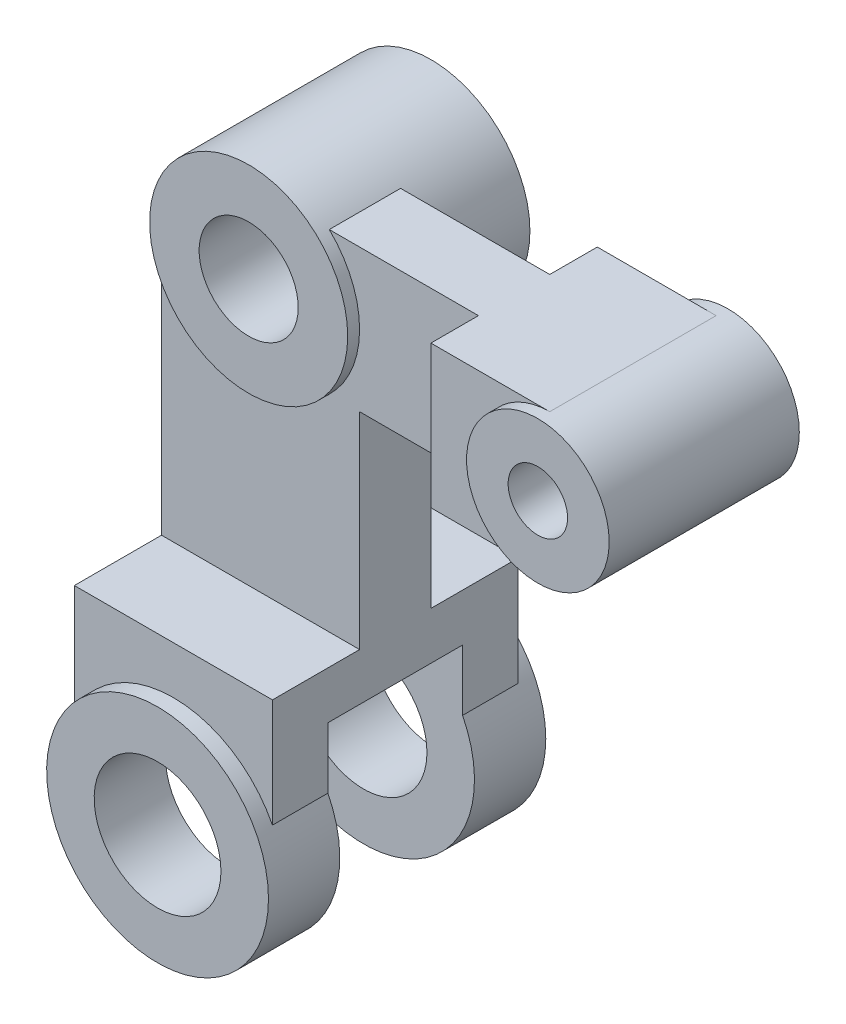
ISO-10303-21;
HEADER;
FILE_DESCRIPTION(('STEP AP214'),'2;1');
FILE_NAME('part.step','',(''),(''),'','','');
FILE_SCHEMA(('AUTOMOTIVE_DESIGN { 1 0 10303 214 1 1 1 1 }'));
ENDSEC;
DATA;
#1=APPLICATION_CONTEXT('core data for automotive mechanical design processes');
#2=APPLICATION_PROTOCOL_DEFINITION('international standard','automotive_design',2000,#1);
#3=PRODUCT_CONTEXT('',#1,'mechanical');
#4=PRODUCT('Part','Part','',(#3));
#5=PRODUCT_RELATED_PRODUCT_CATEGORY('part','',(#4));
#6=PRODUCT_DEFINITION_FORMATION('','',#4);
#7=PRODUCT_DEFINITION_CONTEXT('part definition',#1,'design');
#8=PRODUCT_DEFINITION('design','',#6,#7);
#9=PRODUCT_DEFINITION_SHAPE('','',#8);
#10=(LENGTH_UNIT() NAMED_UNIT(*) SI_UNIT(.MILLI.,.METRE.));
#11=(NAMED_UNIT(*) PLANE_ANGLE_UNIT() SI_UNIT($,.RADIAN.));
#12=(NAMED_UNIT(*) SI_UNIT($,.STERADIAN.) SOLID_ANGLE_UNIT());
#13=UNCERTAINTY_MEASURE_WITH_UNIT(LENGTH_MEASURE(1.E-05),#10,'distance_accuracy_value','');
#14=(GEOMETRIC_REPRESENTATION_CONTEXT(3) GLOBAL_UNCERTAINTY_ASSIGNED_CONTEXT((#13)) GLOBAL_UNIT_ASSIGNED_CONTEXT((#10,
#11,#12)) REPRESENTATION_CONTEXT('',''));
#15=CARTESIAN_POINT('',(0.,0.,0.));
#16=DIRECTION('',(0.,0.,1.));
#17=DIRECTION('',(1.,0.,0.));
#18=AXIS2_PLACEMENT_3D('',#15,#16,#17);
#19=CARTESIAN_POINT('',(0.,0.,26.));
#20=DIRECTION('',(0.,0.,-1.));
#21=DIRECTION('',(-1.,0.,0.));
#22=AXIS2_PLACEMENT_3D('',#19,#20,#21);
#23=CYLINDRICAL_SURFACE('',#22,16.);
#24=CARTESIAN_POINT('',(0.,0.,-26.));
#25=DIRECTION('',(0.,0.,-1.));
#26=DIRECTION('',(0.,1.,0.));
#27=AXIS2_PLACEMENT_3D('',#24,#25,#26);
#28=CIRCLE('',#27,16.);
#29=CARTESIAN_POINT('',(0.,16.,-26.));
#30=VERTEX_POINT('',#29);
#31=EDGE_CURVE('E276',#30,#30,#28,.T.);
#32=ORIENTED_EDGE('',*,*,#31,.F.);
#33=EDGE_LOOP('',(#32));
#34=FACE_BOUND('',#33,.T.);
#35=CARTESIAN_POINT('',(0.,0.,-44.));
#36=DIRECTION('',(0.,0.,1.));
#37=DIRECTION('',(1.,0.,0.));
#38=AXIS2_PLACEMENT_3D('',#35,#36,#37);
#39=CIRCLE('',#38,16.);
#40=CARTESIAN_POINT('',(16.,0.,-44.));
#41=VERTEX_POINT('',#40);
#42=EDGE_CURVE('E283',#41,#41,#39,.T.);
#43=ORIENTED_EDGE('',*,*,#42,.F.);
#44=EDGE_LOOP('',(#43));
#45=FACE_BOUND('',#44,.T.);
#46=ADVANCED_FACE('F41',(#34,#45),#23,.F.);
#47=CARTESIAN_POINT('',(0.,0.,26.));
#48=DIRECTION('',(0.,0.,-1.));
#49=DIRECTION('',(-1.,0.,0.));
#50=AXIS2_PLACEMENT_3D('',#47,#48,#49);
#51=CYLINDRICAL_SURFACE('',#50,28.);
#52=CARTESIAN_POINT('',(0.,0.,26.));
#53=DIRECTION('',(0.,0.,1.));
#54=DIRECTION('',(1.,0.,0.));
#55=AXIS2_PLACEMENT_3D('',#52,#53,#54);
#56=CIRCLE('',#55,28.);
#57=CARTESIAN_POINT('',(28.,0.,26.));
#58=VERTEX_POINT('',#57);
#59=EDGE_CURVE('E288',#58,#58,#56,.T.);
#60=ORIENTED_EDGE('',*,*,#59,.F.);
#61=EDGE_LOOP('',(#60));
#62=FACE_BOUND('',#61,.T.);
#63=DIRECTION('',(0.,0.,-1.));
#64=VECTOR('',#63,1.);
#65=CARTESIAN_POINT('',(-25.,12.6095202129185,22.));
#66=LINE('',#65,#64);
#67=CARTESIAN_POINT('',(-25.,12.6095202129185,22.));
#68=VERTEX_POINT('',#67);
#69=CARTESIAN_POINT('',(-25.,12.6095202129185,8.));
#70=VERTEX_POINT('',#69);
#71=EDGE_CURVE('E330',#68,#70,#66,.T.);
#72=ORIENTED_EDGE('',*,*,#71,.T.);
#73=CARTESIAN_POINT('',(0.,0.,8.));
#74=DIRECTION('',(0.,0.,1.));
#75=DIRECTION('',(0.,-1.,0.));
#76=AXIS2_PLACEMENT_3D('',#73,#74,#75);
#77=CIRCLE('',#76,28.);
#78=CARTESIAN_POINT('',(25.,12.6095202129185,8.));
#79=VERTEX_POINT('',#78);
#80=EDGE_CURVE('E393',#70,#79,#77,.T.);
#81=ORIENTED_EDGE('',*,*,#80,.T.);
#82=DIRECTION('',(0.,0.,-1.));
#83=VECTOR('',#82,1.);
#84=CARTESIAN_POINT('',(25.,12.6095202129185,22.));
#85=LINE('',#84,#83);
#86=CARTESIAN_POINT('',(25.,12.6095202129185,22.));
#87=VERTEX_POINT('',#86);
#88=EDGE_CURVE('E345',#87,#79,#85,.T.);
#89=ORIENTED_EDGE('',*,*,#88,.F.);
#90=CARTESIAN_POINT('',(0.,0.,22.));
#91=DIRECTION('',(0.,0.,1.));
#92=DIRECTION('',(1.,0.,0.));
#93=AXIS2_PLACEMENT_3D('',#90,#91,#92);
#94=CIRCLE('',#93,28.);
#95=EDGE_CURVE('E300',#87,#68,#94,.T.);
#96=ORIENTED_EDGE('',*,*,#95,.T.);
#97=EDGE_LOOP('',(#72,#81,#89,#96));
#98=FACE_BOUND('',#97,.T.);
#99=ADVANCED_FACE('F481',(#62,#98),#51,.T.);
#100=CARTESIAN_POINT('',(0.,110.,-43.));
#101=DIRECTION('',(0.,0.,1.));
#102=DIRECTION('',(1.,0.,0.));
#103=AXIS2_PLACEMENT_3D('',#100,#101,#102);
#104=CYLINDRICAL_SURFACE('',#103,25.);
#105=CARTESIAN_POINT('',(0.,110.,0.));
#106=DIRECTION('',(0.,0.,1.));
#107=DIRECTION('',(1.,0.,0.));
#108=AXIS2_PLACEMENT_3D('',#105,#106,#107);
#109=CIRCLE('',#108,25.);
#110=CARTESIAN_POINT('',(-25.,110.,0.));
#111=VERTEX_POINT('',#110);
#112=CARTESIAN_POINT('',(17.3493515728975,128.,0.));
#113=VERTEX_POINT('',#112);
#114=EDGE_CURVE('E57',#111,#113,#109,.T.);
#115=ORIENTED_EDGE('',*,*,#114,.T.);
#116=DIRECTION('',(0.,0.,-1.));
#117=VECTOR('',#116,1.);
#118=CARTESIAN_POINT('',(17.3493515728975,128.,0.));
#119=LINE('',#118,#117);
#120=CARTESIAN_POINT('',(17.3493515728975,128.,-18.));
#121=VERTEX_POINT('',#120);
#122=EDGE_CURVE('E234',#113,#121,#119,.T.);
#123=ORIENTED_EDGE('',*,*,#122,.T.);
#124=CARTESIAN_POINT('',(0.,110.,-18.));
#125=DIRECTION('',(0.,0.,1.));
#126=DIRECTION('',(1.,0.,0.));
#127=AXIS2_PLACEMENT_3D('',#124,#125,#126);
#128=CIRCLE('',#127,25.);
#129=CARTESIAN_POINT('',(-25.,110.,-18.));
#130=VERTEX_POINT('',#129);
#131=EDGE_CURVE('E65',#130,#121,#128,.T.);
#132=ORIENTED_EDGE('',*,*,#131,.F.);
#133=DIRECTION('',(0.,0.,1.));
#134=VECTOR('',#133,1.);
#135=CARTESIAN_POINT('',(-25.,110.,-18.));
#136=LINE('',#135,#134);
#137=EDGE_CURVE('E363',#130,#111,#136,.T.);
#138=ORIENTED_EDGE('',*,*,#137,.T.);
#139=EDGE_LOOP('',(#115,#123,#132,#138));
#140=FACE_BOUND('',#139,.T.);
#141=CARTESIAN_POINT('',(0.,110.,-43.));
#142=DIRECTION('',(0.,0.,1.));
#143=DIRECTION('',(1.,0.,0.));
#144=AXIS2_PLACEMENT_3D('',#141,#142,#143);
#145=CIRCLE('',#144,25.);
#146=CARTESIAN_POINT('',(25.,110.,-43.));
#147=VERTEX_POINT('',#146);
#148=EDGE_CURVE('E389',#147,#147,#145,.T.);
#149=ORIENTED_EDGE('',*,*,#148,.T.);
#150=EDGE_LOOP('',(#149));
#151=FACE_BOUND('',#150,.T.);
#152=CARTESIAN_POINT('',(0.,110.,3.));
#153=DIRECTION('',(0.,0.,1.));
#154=DIRECTION('',(1.,0.,0.));
#155=AXIS2_PLACEMENT_3D('',#152,#153,#154);
#156=CIRCLE('',#155,25.);
#157=CARTESIAN_POINT('',(25.,110.,3.));
#158=VERTEX_POINT('',#157);
#159=EDGE_CURVE('E381',#158,#158,#156,.T.);
#160=ORIENTED_EDGE('',*,*,#159,.F.);
#161=EDGE_LOOP('',(#160));
#162=FACE_BOUND('',#161,.T.);
#163=ADVANCED_FACE('F489',(#140,#151,#162),#104,.T.);
#164=CARTESIAN_POINT('',(0.,110.,-43.));
#165=DIRECTION('',(0.,0.,1.));
#166=DIRECTION('',(1.,0.,0.));
#167=AXIS2_PLACEMENT_3D('',#164,#165,#166);
#168=CYLINDRICAL_SURFACE('',#167,12.5);
#169=CARTESIAN_POINT('',(0.,110.,-43.));
#170=DIRECTION('',(0.,0.,1.));
#171=DIRECTION('',(1.,0.,0.));
#172=AXIS2_PLACEMENT_3D('',#169,#170,#171);
#173=CIRCLE('',#172,12.5);
#174=CARTESIAN_POINT('',(12.5,110.,-43.));
#175=VERTEX_POINT('',#174);
#176=EDGE_CURVE('E385',#175,#175,#173,.T.);
#177=ORIENTED_EDGE('',*,*,#176,.F.);
#178=EDGE_LOOP('',(#177));
#179=FACE_BOUND('',#178,.T.);
#180=CARTESIAN_POINT('',(0.,110.,3.));
#181=DIRECTION('',(0.,0.,1.));
#182=DIRECTION('',(1.,0.,0.));
#183=AXIS2_PLACEMENT_3D('',#180,#181,#182);
#184=CIRCLE('',#183,12.5);
#185=CARTESIAN_POINT('',(12.5,110.,3.));
#186=VERTEX_POINT('',#185);
#187=EDGE_CURVE('E377',#186,#186,#184,.T.);
#188=ORIENTED_EDGE('',*,*,#187,.T.);
#189=EDGE_LOOP('',(#188));
#190=FACE_BOUND('',#189,.T.);
#191=ADVANCED_FACE('F43',(#179,#190),#168,.F.);
#192=CARTESIAN_POINT('',(0.,0.,-43.));
#193=DIRECTION('',(0.,0.,1.));
#194=DIRECTION('',(1.,0.,0.));
#195=AXIS2_PLACEMENT_3D('',#192,#193,#194);
#196=PLANE('',#195);
#197=ORIENTED_EDGE('',*,*,#176,.T.);
#198=EDGE_LOOP('',(#197));
#199=FACE_BOUND('',#198,.T.);
#200=ORIENTED_EDGE('',*,*,#148,.F.);
#201=EDGE_LOOP('',(#200));
#202=FACE_BOUND('',#201,.T.);
#203=ADVANCED_FACE('F542',(#199,#202),#196,.F.);
#204=CARTESIAN_POINT('',(0.,0.,3.));
#205=DIRECTION('',(0.,0.,1.));
#206=DIRECTION('',(1.,0.,0.));
#207=AXIS2_PLACEMENT_3D('',#204,#205,#206);
#208=PLANE('',#207);
#209=ORIENTED_EDGE('',*,*,#187,.F.);
#210=EDGE_LOOP('',(#209));
#211=FACE_BOUND('',#210,.T.);
#212=ORIENTED_EDGE('',*,*,#159,.T.);
#213=EDGE_LOOP('',(#212));
#214=FACE_BOUND('',#213,.T.);
#215=ADVANCED_FACE('F541',(#211,#214),#208,.T.);
#216=CARTESIAN_POINT('',(25.,0.,-18.));
#217=DIRECTION('',(1.,0.,0.));
#218=DIRECTION('',(0.,0.,-1.));
#219=AXIS2_PLACEMENT_3D('',#216,#217,#218);
#220=PLANE('',#219);
#221=DIRECTION('',(0.,0.,-1.));
#222=VECTOR('',#221,1.);
#223=CARTESIAN_POINT('',(25.,92.,-18.));
#224=LINE('',#223,#222);
#225=CARTESIAN_POINT('',(25.,92.,0.));
#226=VERTEX_POINT('',#225);
#227=CARTESIAN_POINT('',(25.,92.,-18.));
#228=VERTEX_POINT('',#227);
#229=EDGE_CURVE('E247',#226,#228,#224,.T.);
#230=ORIENTED_EDGE('',*,*,#229,.F.);
#231=DIRECTION('',(0.,1.,0.));
#232=VECTOR('',#231,1.);
#233=CARTESIAN_POINT('',(25.,0.,0.));
#234=LINE('',#233,#232);
#235=CARTESIAN_POINT('',(25.,40.,0.));
#236=VERTEX_POINT('',#235);
#237=EDGE_CURVE('E352',#236,#226,#234,.T.);
#238=ORIENTED_EDGE('',*,*,#237,.F.);
#239=DIRECTION('',(0.,0.,-1.));
#240=VECTOR('',#239,1.);
#241=CARTESIAN_POINT('',(25.,40.,22.));
#242=LINE('',#241,#240);
#243=CARTESIAN_POINT('',(25.,40.,22.));
#244=VERTEX_POINT('',#243);
#245=EDGE_CURVE('E340',#244,#236,#242,.T.);
#246=ORIENTED_EDGE('',*,*,#245,.F.);
#247=DIRECTION('',(0.,1.,0.));
#248=VECTOR('',#247,1.);
#249=CARTESIAN_POINT('',(25.,0.,22.));
#250=LINE('',#249,#248);
#251=EDGE_CURVE('E303',#87,#244,#250,.T.);
#252=ORIENTED_EDGE('',*,*,#251,.F.);
#253=ORIENTED_EDGE('',*,*,#88,.T.);
#254=DIRECTION('',(0.,-1.,0.));
#255=VECTOR('',#254,1.);
#256=CARTESIAN_POINT('',(25.,0.,8.));
#257=LINE('',#256,#255);
#258=CARTESIAN_POINT('',(25.,28.,8.));
#259=VERTEX_POINT('',#258);
#260=EDGE_CURVE('E262',#259,#79,#257,.T.);
#261=ORIENTED_EDGE('',*,*,#260,.F.);
#262=DIRECTION('',(0.,0.,1.));
#263=VECTOR('',#262,1.);
#264=CARTESIAN_POINT('',(25.,28.,-18.));
#265=LINE('',#264,#263);
#266=CARTESIAN_POINT('',(25.,28.,-26.));
#267=VERTEX_POINT('',#266);
#268=EDGE_CURVE('E280',#267,#259,#265,.T.);
#269=ORIENTED_EDGE('',*,*,#268,.F.);
#270=DIRECTION('',(0.,1.,0.));
#271=VECTOR('',#270,1.);
#272=CARTESIAN_POINT('',(25.,0.,-26.));
#273=LINE('',#272,#271);
#274=CARTESIAN_POINT('',(25.,12.6095202129185,-26.));
#275=VERTEX_POINT('',#274);
#276=EDGE_CURVE('E273',#275,#267,#273,.T.);
#277=ORIENTED_EDGE('',*,*,#276,.F.);
#278=CARTESIAN_POINT('',(25.,12.6095202129185,-40.));
#279=VERTEX_POINT('',#278);
#280=EDGE_CURVE('E344',#275,#279,#85,.T.);
#281=ORIENTED_EDGE('',*,*,#280,.T.);
#282=DIRECTION('',(0.,1.,0.));
#283=VECTOR('',#282,1.);
#284=CARTESIAN_POINT('',(25.,0.,-40.));
#285=LINE('',#284,#283);
#286=CARTESIAN_POINT('',(25.,40.,-40.));
#287=VERTEX_POINT('',#286);
#288=EDGE_CURVE('E319',#279,#287,#285,.T.);
#289=ORIENTED_EDGE('',*,*,#288,.T.);
#290=CARTESIAN_POINT('',(25.,40.,-18.));
#291=VERTEX_POINT('',#290);
#292=EDGE_CURVE('E339',#291,#287,#242,.T.);
#293=ORIENTED_EDGE('',*,*,#292,.F.);
#294=DIRECTION('',(0.,1.,0.));
#295=VECTOR('',#294,1.);
#296=CARTESIAN_POINT('',(25.,0.,-18.));
#297=LINE('',#296,#295);
#298=EDGE_CURVE('E360',#291,#228,#297,.T.);
#299=ORIENTED_EDGE('',*,*,#298,.T.);
#300=EDGE_LOOP('',(#230,#238,#246,#252,#253,#261,#269,#277,#281,#289,#293,#299));
#301=FACE_BOUND('',#300,.T.);
#302=ADVANCED_FACE('F415',(#301),#220,.T.);
#303=CARTESIAN_POINT('',(-25.,0.,-18.));
#304=DIRECTION('',(-1.,0.,0.));
#305=DIRECTION('',(0.,-1.,0.));
#306=AXIS2_PLACEMENT_3D('',#303,#304,#305);
#307=PLANE('',#306);
#308=DIRECTION('',(0.,-1.,0.));
#309=VECTOR('',#308,1.);
#310=CARTESIAN_POINT('',(-25.,0.,-26.));
#311=LINE('',#310,#309);
#312=CARTESIAN_POINT('',(-25.,28.,-26.));
#313=VERTEX_POINT('',#312);
#314=CARTESIAN_POINT('',(-25.,12.6095202129185,-26.));
#315=VERTEX_POINT('',#314);
#316=EDGE_CURVE('E270',#313,#315,#311,.T.);
#317=ORIENTED_EDGE('',*,*,#316,.F.);
#318=DIRECTION('',(0.,0.,-1.));
#319=VECTOR('',#318,1.);
#320=CARTESIAN_POINT('',(-25.,28.,-18.));
#321=LINE('',#320,#319);
#322=CARTESIAN_POINT('',(-25.,28.,8.));
#323=VERTEX_POINT('',#322);
#324=EDGE_CURVE('E11',#323,#313,#321,.T.);
#325=ORIENTED_EDGE('',*,*,#324,.F.);
#326=DIRECTION('',(0.,1.,0.));
#327=VECTOR('',#326,1.);
#328=CARTESIAN_POINT('',(-25.,0.,8.));
#329=LINE('',#328,#327);
#330=EDGE_CURVE('E256',#70,#323,#329,.T.);
#331=ORIENTED_EDGE('',*,*,#330,.F.);
#332=ORIENTED_EDGE('',*,*,#71,.F.);
#333=DIRECTION('',(0.,-1.,0.));
#334=VECTOR('',#333,1.);
#335=CARTESIAN_POINT('',(-25.,0.,22.));
#336=LINE('',#335,#334);
#337=CARTESIAN_POINT('',(-25.,40.,22.));
#338=VERTEX_POINT('',#337);
#339=EDGE_CURVE('E311',#338,#68,#336,.T.);
#340=ORIENTED_EDGE('',*,*,#339,.F.);
#341=DIRECTION('',(0.,0.,-1.));
#342=VECTOR('',#341,1.);
#343=CARTESIAN_POINT('',(-25.,40.,22.));
#344=LINE('',#343,#342);
#345=CARTESIAN_POINT('',(-25.,40.,0.));
#346=VERTEX_POINT('',#345);
#347=EDGE_CURVE('E335',#338,#346,#344,.T.);
#348=ORIENTED_EDGE('',*,*,#347,.T.);
#349=DIRECTION('',(0.,-1.,0.));
#350=VECTOR('',#349,1.);
#351=CARTESIAN_POINT('',(-25.,0.,0.));
#352=LINE('',#351,#350);
#353=EDGE_CURVE('E366',#111,#346,#352,.T.);
#354=ORIENTED_EDGE('',*,*,#353,.F.);
#355=ORIENTED_EDGE('',*,*,#137,.F.);
#356=DIRECTION('',(0.,-1.,0.));
#357=VECTOR('',#356,1.);
#358=CARTESIAN_POINT('',(-25.,0.,-18.));
#359=LINE('',#358,#357);
#360=CARTESIAN_POINT('',(-25.,40.,-18.));
#361=VERTEX_POINT('',#360);
#362=EDGE_CURVE('E351',#130,#361,#359,.T.);
#363=ORIENTED_EDGE('',*,*,#362,.T.);
#364=CARTESIAN_POINT('',(-25.,40.,-40.));
#365=VERTEX_POINT('',#364);
#366=EDGE_CURVE('E334',#361,#365,#344,.T.);
#367=ORIENTED_EDGE('',*,*,#366,.T.);
#368=DIRECTION('',(0.,-1.,0.));
#369=VECTOR('',#368,1.);
#370=CARTESIAN_POINT('',(-25.,0.,-40.));
#371=LINE('',#370,#369);
#372=CARTESIAN_POINT('',(-25.,12.6095202129185,-40.));
#373=VERTEX_POINT('',#372);
#374=EDGE_CURVE('E304',#365,#373,#371,.T.);
#375=ORIENTED_EDGE('',*,*,#374,.T.);
#376=EDGE_CURVE('E315',#315,#373,#66,.T.);
#377=ORIENTED_EDGE('',*,*,#376,.F.);
#378=EDGE_LOOP('',(#317,#325,#331,#332,#340,#348,#354,#355,#363,#367,#375,#377));
#379=FACE_BOUND('',#378,.T.);
#380=ADVANCED_FACE('F407',(#379),#307,.T.);
#381=CARTESIAN_POINT('',(0.,0.,-18.));
#382=DIRECTION('',(0.,0.,1.));
#383=DIRECTION('',(1.,0.,0.));
#384=AXIS2_PLACEMENT_3D('',#381,#382,#383);
#385=PLANE('',#384);
#386=ORIENTED_EDGE('',*,*,#131,.T.);
#387=DIRECTION('',(-1.,0.,0.));
#388=VECTOR('',#387,1.);
#389=CARTESIAN_POINT('',(0.,128.,-18.));
#390=LINE('',#389,#388);
#391=CARTESIAN_POINT('',(55.,128.,-18.));
#392=VERTEX_POINT('',#391);
#393=EDGE_CURVE('E228',#392,#121,#390,.T.);
#394=ORIENTED_EDGE('',*,*,#393,.F.);
#395=DIRECTION('',(0.,-1.,0.));
#396=VECTOR('',#395,1.);
#397=CARTESIAN_POINT('',(55.,0.,-18.));
#398=LINE('',#397,#396);
#399=CARTESIAN_POINT('',(55.,92.,-18.));
#400=VERTEX_POINT('',#399);
#401=EDGE_CURVE('E238',#392,#400,#398,.T.);
#402=ORIENTED_EDGE('',*,*,#401,.T.);
#403=DIRECTION('',(-1.,0.,0.));
#404=VECTOR('',#403,1.);
#405=CARTESIAN_POINT('',(0.,92.,-18.));
#406=LINE('',#405,#404);
#407=EDGE_CURVE('E220',#400,#228,#406,.T.);
#408=ORIENTED_EDGE('',*,*,#407,.T.);
#409=ORIENTED_EDGE('',*,*,#298,.F.);
#410=DIRECTION('',(1.,0.,0.));
#411=VECTOR('',#410,1.);
#412=CARTESIAN_POINT('',(0.,40.,-18.));
#413=LINE('',#412,#411);
#414=EDGE_CURVE('E356',#361,#291,#413,.T.);
#415=ORIENTED_EDGE('',*,*,#414,.F.);
#416=ORIENTED_EDGE('',*,*,#362,.F.);
#417=EDGE_LOOP('',(#386,#394,#402,#408,#409,#415,#416));
#418=FACE_BOUND('',#417,.T.);
#419=ADVANCED_FACE('F426',(#418),#385,.F.);
#420=CARTESIAN_POINT('',(0.,0.,0.));
#421=DIRECTION('',(0.,0.,1.));
#422=DIRECTION('',(1.,0.,0.));
#423=AXIS2_PLACEMENT_3D('',#420,#421,#422);
#424=PLANE('',#423);
#425=ORIENTED_EDGE('',*,*,#237,.T.);
#426=DIRECTION('',(-1.,0.,0.));
#427=VECTOR('',#426,1.);
#428=CARTESIAN_POINT('',(0.,92.,0.));
#429=LINE('',#428,#427);
#430=CARTESIAN_POINT('',(55.,92.,0.));
#431=VERTEX_POINT('',#430);
#432=EDGE_CURVE('E225',#431,#226,#429,.T.);
#433=ORIENTED_EDGE('',*,*,#432,.F.);
#434=DIRECTION('',(0.,-1.,0.));
#435=VECTOR('',#434,1.);
#436=CARTESIAN_POINT('',(55.,0.,0.));
#437=LINE('',#436,#435);
#438=CARTESIAN_POINT('',(55.,128.,0.));
#439=VERTEX_POINT('',#438);
#440=EDGE_CURVE('E200',#439,#431,#437,.T.);
#441=ORIENTED_EDGE('',*,*,#440,.F.);
#442=DIRECTION('',(-1.,0.,0.));
#443=VECTOR('',#442,1.);
#444=CARTESIAN_POINT('',(0.,128.,0.));
#445=LINE('',#444,#443);
#446=EDGE_CURVE('E231',#439,#113,#445,.T.);
#447=ORIENTED_EDGE('',*,*,#446,.T.);
#448=ORIENTED_EDGE('',*,*,#114,.F.);
#449=ORIENTED_EDGE('',*,*,#353,.T.);
#450=DIRECTION('',(1.,0.,0.));
#451=VECTOR('',#450,1.);
#452=CARTESIAN_POINT('',(0.,40.,0.));
#453=LINE('',#452,#451);
#454=EDGE_CURVE('E369',#346,#236,#453,.T.);
#455=ORIENTED_EDGE('',*,*,#454,.T.);
#456=EDGE_LOOP('',(#425,#433,#441,#447,#448,#449,#455));
#457=FACE_BOUND('',#456,.T.);
#458=ADVANCED_FACE('F534',(#457),#424,.T.);
#459=CARTESIAN_POINT('',(0.,40.,22.));
#460=DIRECTION('',(0.,1.,0.));
#461=DIRECTION('',(0.,0.,1.));
#462=AXIS2_PLACEMENT_3D('',#459,#460,#461);
#463=PLANE('',#462);
#464=ORIENTED_EDGE('',*,*,#454,.F.);
#465=ORIENTED_EDGE('',*,*,#347,.F.);
#466=DIRECTION('',(1.,0.,0.));
#467=VECTOR('',#466,1.);
#468=CARTESIAN_POINT('',(0.,40.,22.));
#469=LINE('',#468,#467);
#470=EDGE_CURVE('E307',#338,#244,#469,.T.);
#471=ORIENTED_EDGE('',*,*,#470,.T.);
#472=ORIENTED_EDGE('',*,*,#245,.T.);
#473=EDGE_LOOP('',(#464,#465,#471,#472));
#474=FACE_BOUND('',#473,.T.);
#475=ADVANCED_FACE('F530',(#474),#463,.T.);
#476=ORIENTED_EDGE('',*,*,#366,.F.);
#477=ORIENTED_EDGE('',*,*,#414,.T.);
#478=ORIENTED_EDGE('',*,*,#292,.T.);
#479=DIRECTION('',(1.,0.,0.));
#480=VECTOR('',#479,1.);
#481=CARTESIAN_POINT('',(0.,40.,-40.));
#482=LINE('',#481,#480);
#483=EDGE_CURVE('E323',#365,#287,#482,.T.);
#484=ORIENTED_EDGE('',*,*,#483,.F.);
#485=EDGE_LOOP('',(#476,#477,#478,#484));
#486=FACE_BOUND('',#485,.T.);
#487=ADVANCED_FACE('F424',(#486),#463,.T.);
#488=CARTESIAN_POINT('',(0.,0.,22.));
#489=DIRECTION('',(0.,0.,1.));
#490=DIRECTION('',(1.,0.,0.));
#491=AXIS2_PLACEMENT_3D('',#488,#489,#490);
#492=PLANE('',#491);
#493=ORIENTED_EDGE('',*,*,#95,.F.);
#494=ORIENTED_EDGE('',*,*,#251,.T.);
#495=ORIENTED_EDGE('',*,*,#470,.F.);
#496=ORIENTED_EDGE('',*,*,#339,.T.);
#497=EDGE_LOOP('',(#493,#494,#495,#496));
#498=FACE_BOUND('',#497,.T.);
#499=ADVANCED_FACE('F502',(#498),#492,.T.);
#500=CARTESIAN_POINT('',(0.,0.,-40.));
#501=DIRECTION('',(0.,0.,1.));
#502=DIRECTION('',(1.,0.,0.));
#503=AXIS2_PLACEMENT_3D('',#500,#501,#502);
#504=PLANE('',#503);
#505=CARTESIAN_POINT('',(0.,0.,-40.));
#506=DIRECTION('',(0.,0.,1.));
#507=DIRECTION('',(1.,0.,0.));
#508=AXIS2_PLACEMENT_3D('',#505,#506,#507);
#509=CIRCLE('',#508,28.);
#510=EDGE_CURVE('E293',#279,#373,#509,.T.);
#511=ORIENTED_EDGE('',*,*,#510,.T.);
#512=ORIENTED_EDGE('',*,*,#374,.F.);
#513=ORIENTED_EDGE('',*,*,#483,.T.);
#514=ORIENTED_EDGE('',*,*,#288,.F.);
#515=EDGE_LOOP('',(#511,#512,#513,#514));
#516=FACE_BOUND('',#515,.T.);
#517=ADVANCED_FACE('F420',(#516),#504,.F.);
#518=CARTESIAN_POINT('',(0.,0.,8.));
#519=DIRECTION('',(0.,0.,1.));
#520=DIRECTION('',(0.,-1.,0.));
#521=AXIS2_PLACEMENT_3D('',#518,#519,#520);
#522=CIRCLE('',#521,16.);
#523=CARTESIAN_POINT('',(0.,-16.,8.00000000000001));
#524=VERTEX_POINT('',#523);
#525=EDGE_CURVE('E266',#524,#524,#522,.T.);
#526=ORIENTED_EDGE('',*,*,#525,.F.);
#527=EDGE_LOOP('',(#526));
#528=FACE_BOUND('',#527,.T.);
#529=CARTESIAN_POINT('',(0.,0.,26.));
#530=DIRECTION('',(0.,0.,1.));
#531=DIRECTION('',(1.,0.,0.));
#532=AXIS2_PLACEMENT_3D('',#529,#530,#531);
#533=CIRCLE('',#532,16.);
#534=CARTESIAN_POINT('',(16.,0.,26.));
#535=VERTEX_POINT('',#534);
#536=EDGE_CURVE('E284',#535,#535,#533,.T.);
#537=ORIENTED_EDGE('',*,*,#536,.T.);
#538=EDGE_LOOP('',(#537));
#539=FACE_BOUND('',#538,.T.);
#540=ADVANCED_FACE('F484',(#528,#539),#23,.F.);
#541=ORIENTED_EDGE('',*,*,#280,.F.);
#542=CARTESIAN_POINT('',(0.,0.,-26.));
#543=DIRECTION('',(0.,0.,-1.));
#544=DIRECTION('',(0.,1.,0.));
#545=AXIS2_PLACEMENT_3D('',#542,#543,#544);
#546=CIRCLE('',#545,28.);
#547=EDGE_CURVE('E50',#275,#315,#546,.T.);
#548=ORIENTED_EDGE('',*,*,#547,.T.);
#549=ORIENTED_EDGE('',*,*,#376,.T.);
#550=ORIENTED_EDGE('',*,*,#510,.F.);
#551=EDGE_LOOP('',(#541,#548,#549,#550));
#552=FACE_BOUND('',#551,.T.);
#553=CARTESIAN_POINT('',(0.,0.,-44.));
#554=DIRECTION('',(0.,0.,1.));
#555=DIRECTION('',(1.,0.,0.));
#556=AXIS2_PLACEMENT_3D('',#553,#554,#555);
#557=CIRCLE('',#556,28.);
#558=CARTESIAN_POINT('',(28.,0.,-44.));
#559=VERTEX_POINT('',#558);
#560=EDGE_CURVE('E289',#559,#559,#557,.T.);
#561=ORIENTED_EDGE('',*,*,#560,.T.);
#562=EDGE_LOOP('',(#561));
#563=FACE_BOUND('',#562,.T.);
#564=ADVANCED_FACE('F400',(#552,#563),#51,.T.);
#565=CARTESIAN_POINT('',(0.,0.,26.));
#566=DIRECTION('',(0.,0.,1.));
#567=DIRECTION('',(1.,0.,0.));
#568=AXIS2_PLACEMENT_3D('',#565,#566,#567);
#569=PLANE('',#568);
#570=ORIENTED_EDGE('',*,*,#536,.F.);
#571=EDGE_LOOP('',(#570));
#572=FACE_BOUND('',#571,.T.);
#573=ORIENTED_EDGE('',*,*,#59,.T.);
#574=EDGE_LOOP('',(#573));
#575=FACE_BOUND('',#574,.T.);
#576=ADVANCED_FACE('F501',(#572,#575),#569,.T.);
#577=CARTESIAN_POINT('',(0.,0.,-44.));
#578=DIRECTION('',(0.,0.,1.));
#579=DIRECTION('',(1.,0.,0.));
#580=AXIS2_PLACEMENT_3D('',#577,#578,#579);
#581=PLANE('',#580);
#582=ORIENTED_EDGE('',*,*,#42,.T.);
#583=EDGE_LOOP('',(#582));
#584=FACE_BOUND('',#583,.T.);
#585=ORIENTED_EDGE('',*,*,#560,.F.);
#586=EDGE_LOOP('',(#585));
#587=FACE_BOUND('',#586,.T.);
#588=ADVANCED_FACE('F510',(#584,#587),#581,.F.);
#589=CARTESIAN_POINT('',(28.,28.,-26.));
#590=DIRECTION('',(0.,0.,-1.));
#591=DIRECTION('',(0.,1.,0.));
#592=AXIS2_PLACEMENT_3D('',#589,#590,#591);
#593=PLANE('',#592);
#594=ORIENTED_EDGE('',*,*,#31,.T.);
#595=EDGE_LOOP('',(#594));
#596=FACE_BOUND('',#595,.T.);
#597=ORIENTED_EDGE('',*,*,#276,.T.);
#598=DIRECTION('',(-1.,0.,0.));
#599=VECTOR('',#598,1.);
#600=CARTESIAN_POINT('',(28.,28.,-26.));
#601=LINE('',#600,#599);
#602=EDGE_CURVE('E252',#267,#313,#601,.T.);
#603=ORIENTED_EDGE('',*,*,#602,.T.);
#604=ORIENTED_EDGE('',*,*,#316,.T.);
#605=ORIENTED_EDGE('',*,*,#547,.F.);
#606=EDGE_LOOP('',(#597,#603,#604,#605));
#607=FACE_BOUND('',#606,.T.);
#608=ADVANCED_FACE('F587',(#596,#607),#593,.F.);
#609=CARTESIAN_POINT('',(28.,28.,8.));
#610=DIRECTION('',(0.,0.,1.));
#611=DIRECTION('',(0.,-1.,0.));
#612=AXIS2_PLACEMENT_3D('',#609,#610,#611);
#613=PLANE('',#612);
#614=ORIENTED_EDGE('',*,*,#525,.T.);
#615=EDGE_LOOP('',(#614));
#616=FACE_BOUND('',#615,.T.);
#617=ORIENTED_EDGE('',*,*,#260,.T.);
#618=ORIENTED_EDGE('',*,*,#80,.F.);
#619=ORIENTED_EDGE('',*,*,#330,.T.);
#620=DIRECTION('',(-1.,0.,0.));
#621=VECTOR('',#620,1.);
#622=CARTESIAN_POINT('',(28.,28.,8.));
#623=LINE('',#622,#621);
#624=EDGE_CURVE('E251',#259,#323,#623,.T.);
#625=ORIENTED_EDGE('',*,*,#624,.F.);
#626=EDGE_LOOP('',(#617,#618,#619,#625));
#627=FACE_BOUND('',#626,.T.);
#628=ADVANCED_FACE('F521',(#616,#627),#613,.F.);
#629=CARTESIAN_POINT('',(28.,28.,-26.));
#630=DIRECTION('',(0.,1.,0.));
#631=DIRECTION('',(-1.,0.,0.));
#632=AXIS2_PLACEMENT_3D('',#629,#630,#631);
#633=PLANE('',#632);
#634=ORIENTED_EDGE('',*,*,#268,.T.);
#635=ORIENTED_EDGE('',*,*,#624,.T.);
#636=ORIENTED_EDGE('',*,*,#324,.T.);
#637=ORIENTED_EDGE('',*,*,#602,.F.);
#638=EDGE_LOOP('',(#634,#635,#636,#637));
#639=FACE_BOUND('',#638,.T.);
#640=ADVANCED_FACE('F477',(#639),#633,.F.);
#641=CARTESIAN_POINT('',(0.,92.,0.));
#642=DIRECTION('',(0.,-1.,0.));
#643=DIRECTION('',(0.,0.,-1.));
#644=AXIS2_PLACEMENT_3D('',#641,#642,#643);
#645=PLANE('',#644);
#646=ORIENTED_EDGE('',*,*,#432,.T.);
#647=ORIENTED_EDGE('',*,*,#229,.T.);
#648=ORIENTED_EDGE('',*,*,#407,.F.);
#649=DIRECTION('',(0.,0.,-1.));
#650=VECTOR('',#649,1.);
#651=CARTESIAN_POINT('',(55.,92.,12.));
#652=LINE('',#651,#650);
#653=CARTESIAN_POINT('',(55.,92.,-30.));
#654=VERTEX_POINT('',#653);
#655=EDGE_CURVE('E203',#400,#654,#652,.T.);
#656=ORIENTED_EDGE('',*,*,#655,.T.);
#657=DIRECTION('',(1.,0.,0.));
#658=VECTOR('',#657,1.);
#659=CARTESIAN_POINT('',(0.,92.,-30.));
#660=LINE('',#659,#658);
#661=CARTESIAN_POINT('',(85.,92.,-30.));
#662=VERTEX_POINT('',#661);
#663=EDGE_CURVE('E436',#654,#662,#660,.T.);
#664=ORIENTED_EDGE('',*,*,#663,.T.);
#665=DIRECTION('',(0.,0.,-1.));
#666=VECTOR('',#665,1.);
#667=CARTESIAN_POINT('',(85.,92.,12.));
#668=LINE('',#667,#666);
#669=CARTESIAN_POINT('',(85.,92.,12.));
#670=VERTEX_POINT('',#669);
#671=EDGE_CURVE('E180',#670,#662,#668,.T.);
#672=ORIENTED_EDGE('',*,*,#671,.F.);
#673=DIRECTION('',(1.,0.,0.));
#674=VECTOR('',#673,1.);
#675=CARTESIAN_POINT('',(0.,92.,12.));
#676=LINE('',#675,#674);
#677=CARTESIAN_POINT('',(55.,92.,12.));
#678=VERTEX_POINT('',#677);
#679=EDGE_CURVE('E173',#678,#670,#676,.T.);
#680=ORIENTED_EDGE('',*,*,#679,.F.);
#681=EDGE_CURVE('E178',#678,#431,#652,.T.);
#682=ORIENTED_EDGE('',*,*,#681,.T.);
#683=EDGE_LOOP('',(#646,#647,#648,#656,#664,#672,#680,#682));
#684=FACE_BOUND('',#683,.T.);
#685=ADVANCED_FACE('F176',(#684),#645,.T.);
#686=CARTESIAN_POINT('',(0.,128.,0.));
#687=DIRECTION('',(0.,-1.,0.));
#688=DIRECTION('',(0.,0.,-1.));
#689=AXIS2_PLACEMENT_3D('',#686,#687,#688);
#690=PLANE('',#689);
#691=ORIENTED_EDGE('',*,*,#393,.T.);
#692=ORIENTED_EDGE('',*,*,#122,.F.);
#693=ORIENTED_EDGE('',*,*,#446,.F.);
#694=DIRECTION('',(0.,0.,-1.));
#695=VECTOR('',#694,1.);
#696=CARTESIAN_POINT('',(55.,128.,12.));
#697=LINE('',#696,#695);
#698=CARTESIAN_POINT('',(55.,128.,12.));
#699=VERTEX_POINT('',#698);
#700=EDGE_CURVE('E453',#699,#439,#697,.T.);
#701=ORIENTED_EDGE('',*,*,#700,.F.);
#702=DIRECTION('',(-1.,0.,0.));
#703=VECTOR('',#702,1.);
#704=CARTESIAN_POINT('',(-1.1842378929335E-13,128.,12.));
#705=LINE('',#704,#703);
#706=CARTESIAN_POINT('',(85.,128.,12.));
#707=VERTEX_POINT('',#706);
#708=EDGE_CURVE('E190',#707,#699,#705,.T.);
#709=ORIENTED_EDGE('',*,*,#708,.F.);
#710=DIRECTION('',(0.,0.,-1.));
#711=VECTOR('',#710,1.);
#712=CARTESIAN_POINT('',(85.,128.,12.));
#713=LINE('',#712,#711);
#714=CARTESIAN_POINT('',(85.,128.,-30.));
#715=VERTEX_POINT('',#714);
#716=EDGE_CURVE('E455',#707,#715,#713,.T.);
#717=ORIENTED_EDGE('',*,*,#716,.T.);
#718=DIRECTION('',(-1.,0.,0.));
#719=VECTOR('',#718,1.);
#720=CARTESIAN_POINT('',(-1.1842378929335E-13,128.,-30.));
#721=LINE('',#720,#719);
#722=CARTESIAN_POINT('',(55.,128.,-30.));
#723=VERTEX_POINT('',#722);
#724=EDGE_CURVE('E195',#715,#723,#721,.T.);
#725=ORIENTED_EDGE('',*,*,#724,.T.);
#726=EDGE_CURVE('E456',#392,#723,#697,.T.);
#727=ORIENTED_EDGE('',*,*,#726,.F.);
#728=EDGE_LOOP('',(#691,#692,#693,#701,#709,#717,#725,#727));
#729=FACE_BOUND('',#728,.T.);
#730=ADVANCED_FACE('F468',(#729),#690,.F.);
#731=CARTESIAN_POINT('',(55.,0.,12.));
#732=DIRECTION('',(1.,0.,0.));
#733=DIRECTION('',(0.,0.,-1.));
#734=AXIS2_PLACEMENT_3D('',#731,#732,#733);
#735=PLANE('',#734);
#736=ORIENTED_EDGE('',*,*,#700,.T.);
#737=ORIENTED_EDGE('',*,*,#440,.T.);
#738=ORIENTED_EDGE('',*,*,#681,.F.);
#739=DIRECTION('',(0.,-1.,0.));
#740=VECTOR('',#739,1.);
#741=CARTESIAN_POINT('',(55.,0.,12.));
#742=LINE('',#741,#740);
#743=EDGE_CURVE('E185',#699,#678,#742,.T.);
#744=ORIENTED_EDGE('',*,*,#743,.F.);
#745=EDGE_LOOP('',(#736,#737,#738,#744));
#746=FACE_BOUND('',#745,.T.);
#747=ADVANCED_FACE('F198',(#746),#735,.F.);
#748=CARTESIAN_POINT('',(85.,110.,15.));
#749=DIRECTION('',(0.,0.,-1.));
#750=DIRECTION('',(-1.,0.,0.));
#751=AXIS2_PLACEMENT_3D('',#748,#749,#750);
#752=CYLINDRICAL_SURFACE('',#751,18.);
#753=ORIENTED_EDGE('',*,*,#716,.F.);
#754=CARTESIAN_POINT('',(85.,110.,12.));
#755=DIRECTION('',(0.,0.,1.));
#756=DIRECTION('',(1.,0.,0.));
#757=AXIS2_PLACEMENT_3D('',#754,#755,#756);
#758=CIRCLE('',#757,18.);
#759=EDGE_CURVE('E184',#707,#670,#758,.T.);
#760=ORIENTED_EDGE('',*,*,#759,.T.);
#761=ORIENTED_EDGE('',*,*,#671,.T.);
#762=CARTESIAN_POINT('',(85.,110.,-30.));
#763=DIRECTION('',(0.,0.,1.));
#764=DIRECTION('',(1.,0.,0.));
#765=AXIS2_PLACEMENT_3D('',#762,#763,#764);
#766=CIRCLE('',#765,18.);
#767=EDGE_CURVE('E441',#715,#662,#766,.T.);
#768=ORIENTED_EDGE('',*,*,#767,.F.);
#769=EDGE_LOOP('',(#753,#760,#761,#768));
#770=FACE_BOUND('',#769,.T.);
#771=CARTESIAN_POINT('',(85.,110.,15.));
#772=DIRECTION('',(0.,0.,1.));
#773=DIRECTION('',(1.,0.,0.));
#774=AXIS2_PLACEMENT_3D('',#771,#772,#773);
#775=CIRCLE('',#774,18.);
#776=CARTESIAN_POINT('',(103.,110.,15.));
#777=VERTEX_POINT('',#776);
#778=EDGE_CURVE('E213',#777,#777,#775,.T.);
#779=ORIENTED_EDGE('',*,*,#778,.F.);
#780=EDGE_LOOP('',(#779));
#781=FACE_BOUND('',#780,.T.);
#782=CARTESIAN_POINT('',(85.,110.,-33.));
#783=DIRECTION('',(0.,0.,1.));
#784=DIRECTION('',(1.,0.,0.));
#785=AXIS2_PLACEMENT_3D('',#782,#783,#784);
#786=CIRCLE('',#785,18.);
#787=CARTESIAN_POINT('',(103.,110.,-33.));
#788=VERTEX_POINT('',#787);
#789=EDGE_CURVE('E202',#788,#788,#786,.T.);
#790=ORIENTED_EDGE('',*,*,#789,.T.);
#791=EDGE_LOOP('',(#790));
#792=FACE_BOUND('',#791,.T.);
#793=ADVANCED_FACE('F462',(#770,#781,#792),#752,.T.);
#794=CARTESIAN_POINT('',(85.,110.,15.));
#795=DIRECTION('',(0.,0.,-1.));
#796=DIRECTION('',(-1.,0.,0.));
#797=AXIS2_PLACEMENT_3D('',#794,#795,#796);
#798=CYLINDRICAL_SURFACE('',#797,7.50000000000003);
#799=CARTESIAN_POINT('',(85.,110.,15.));
#800=DIRECTION('',(0.,0.,1.));
#801=DIRECTION('',(1.,0.,0.));
#802=AXIS2_PLACEMENT_3D('',#799,#800,#801);
#803=CIRCLE('',#802,7.50000000000003);
#804=CARTESIAN_POINT('',(92.5,110.,15.));
#805=VERTEX_POINT('',#804);
#806=EDGE_CURVE('E217',#805,#805,#803,.T.);
#807=ORIENTED_EDGE('',*,*,#806,.T.);
#808=EDGE_LOOP('',(#807));
#809=FACE_BOUND('',#808,.T.);
#810=CARTESIAN_POINT('',(85.,110.,-33.));
#811=DIRECTION('',(0.,0.,1.));
#812=DIRECTION('',(1.,0.,0.));
#813=AXIS2_PLACEMENT_3D('',#810,#811,#812);
#814=CIRCLE('',#813,7.50000000000003);
#815=CARTESIAN_POINT('',(92.5,110.,-33.));
#816=VERTEX_POINT('',#815);
#817=EDGE_CURVE('E208',#816,#816,#814,.T.);
#818=ORIENTED_EDGE('',*,*,#817,.F.);
#819=EDGE_LOOP('',(#818));
#820=FACE_BOUND('',#819,.T.);
#821=ADVANCED_FACE('F692',(#809,#820),#798,.F.);
#822=CARTESIAN_POINT('',(0.,0.,15.));
#823=DIRECTION('',(0.,0.,1.));
#824=DIRECTION('',(1.,0.,0.));
#825=AXIS2_PLACEMENT_3D('',#822,#823,#824);
#826=PLANE('',#825);
#827=ORIENTED_EDGE('',*,*,#778,.T.);
#828=EDGE_LOOP('',(#827));
#829=FACE_BOUND('',#828,.T.);
#830=ORIENTED_EDGE('',*,*,#806,.F.);
#831=EDGE_LOOP('',(#830));
#832=FACE_BOUND('',#831,.T.);
#833=ADVANCED_FACE('F700',(#829,#832),#826,.T.);
#834=CARTESIAN_POINT('',(0.,0.,-33.));
#835=DIRECTION('',(0.,0.,1.));
#836=DIRECTION('',(1.,0.,0.));
#837=AXIS2_PLACEMENT_3D('',#834,#835,#836);
#838=PLANE('',#837);
#839=ORIENTED_EDGE('',*,*,#789,.F.);
#840=EDGE_LOOP('',(#839));
#841=FACE_BOUND('',#840,.T.);
#842=ORIENTED_EDGE('',*,*,#817,.T.);
#843=EDGE_LOOP('',(#842));
#844=FACE_BOUND('',#843,.T.);
#845=ADVANCED_FACE('F710',(#841,#844),#838,.F.);
#846=ORIENTED_EDGE('',*,*,#401,.F.);
#847=ORIENTED_EDGE('',*,*,#726,.T.);
#848=DIRECTION('',(0.,-1.,0.));
#849=VECTOR('',#848,1.);
#850=CARTESIAN_POINT('',(55.,0.,-30.));
#851=LINE('',#850,#849);
#852=EDGE_CURVE('E434',#723,#654,#851,.T.);
#853=ORIENTED_EDGE('',*,*,#852,.T.);
#854=ORIENTED_EDGE('',*,*,#655,.F.);
#855=EDGE_LOOP('',(#846,#847,#853,#854));
#856=FACE_BOUND('',#855,.T.);
#857=ADVANCED_FACE('F432',(#856),#735,.F.);
#858=CARTESIAN_POINT('',(0.,0.,12.));
#859=DIRECTION('',(0.,0.,1.));
#860=DIRECTION('',(1.,0.,0.));
#861=AXIS2_PLACEMENT_3D('',#858,#859,#860);
#862=PLANE('',#861);
#863=ORIENTED_EDGE('',*,*,#743,.T.);
#864=ORIENTED_EDGE('',*,*,#679,.T.);
#865=ORIENTED_EDGE('',*,*,#759,.F.);
#866=ORIENTED_EDGE('',*,*,#708,.T.);
#867=EDGE_LOOP('',(#863,#864,#865,#866));
#868=FACE_BOUND('',#867,.T.);
#869=ADVANCED_FACE('F188',(#868),#862,.T.);
#870=CARTESIAN_POINT('',(0.,0.,-30.));
#871=DIRECTION('',(0.,0.,1.));
#872=DIRECTION('',(1.,0.,0.));
#873=AXIS2_PLACEMENT_3D('',#870,#871,#872);
#874=PLANE('',#873);
#875=ORIENTED_EDGE('',*,*,#852,.F.);
#876=ORIENTED_EDGE('',*,*,#724,.F.);
#877=ORIENTED_EDGE('',*,*,#767,.T.);
#878=ORIENTED_EDGE('',*,*,#663,.F.);
#879=EDGE_LOOP('',(#875,#876,#877,#878));
#880=FACE_BOUND('',#879,.T.);
#881=ADVANCED_FACE('F439',(#880),#874,.F.);
#882=CLOSED_SHELL('',(#46,#99,#163,#191,#203,#215,#302,#380,#419,#458,#475,#487,#499,#517,#540,
#564,#576,#588,#608,#628,#640,#685,#730,#747,#793,#821,#833,#845,#857,#869,#881));
#883=MANIFOLD_SOLID_BREP('B2',#882);
#884=ADVANCED_BREP_SHAPE_REPRESENTATION('',(#18,#883),#14);
#885=SHAPE_DEFINITION_REPRESENTATION(#9,#884);
ENDSEC;
END-ISO-10303-21;
